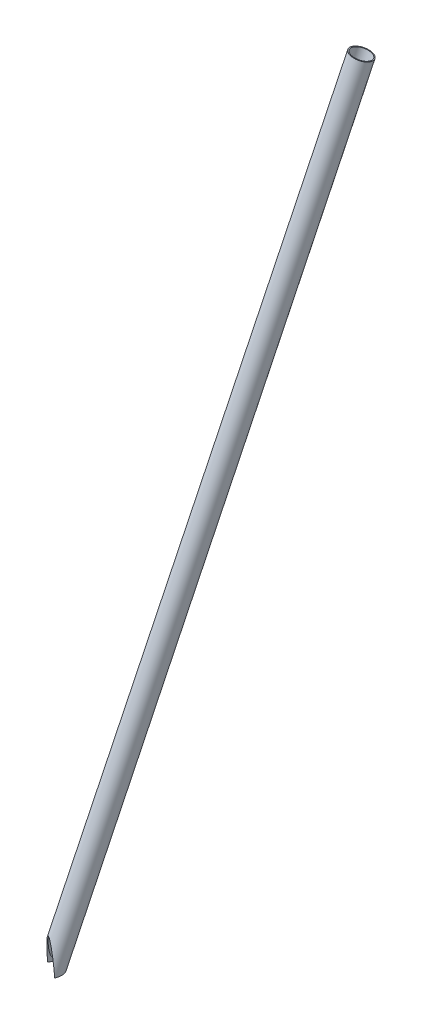
ISO-10303-21;
HEADER;
FILE_DESCRIPTION(('STEP AP214'),'2;1');
FILE_NAME('part.step','',(''),(''),'','','');
FILE_SCHEMA(('AUTOMOTIVE_DESIGN { 1 0 10303 214 1 1 1 1 }'));
ENDSEC;
DATA;
#1=APPLICATION_CONTEXT('core data for automotive mechanical design processes');
#2=APPLICATION_PROTOCOL_DEFINITION('international standard','automotive_design',2000,#1);
#3=PRODUCT_CONTEXT('',#1,'mechanical');
#4=PRODUCT('Part','Part','',(#3));
#5=PRODUCT_RELATED_PRODUCT_CATEGORY('part','',(#4));
#6=PRODUCT_DEFINITION_FORMATION('','',#4);
#7=PRODUCT_DEFINITION_CONTEXT('part definition',#1,'design');
#8=PRODUCT_DEFINITION('design','',#6,#7);
#9=PRODUCT_DEFINITION_SHAPE('','',#8);
#10=(LENGTH_UNIT() NAMED_UNIT(*) SI_UNIT(.MILLI.,.METRE.));
#11=(NAMED_UNIT(*) PLANE_ANGLE_UNIT() SI_UNIT($,.RADIAN.));
#12=(NAMED_UNIT(*) SI_UNIT($,.STERADIAN.) SOLID_ANGLE_UNIT());
#13=UNCERTAINTY_MEASURE_WITH_UNIT(LENGTH_MEASURE(1.E-05),#10,'distance_accuracy_value','');
#14=(GEOMETRIC_REPRESENTATION_CONTEXT(3) GLOBAL_UNCERTAINTY_ASSIGNED_CONTEXT((#13)) GLOBAL_UNIT_ASSIGNED_CONTEXT((#10,
#11,#12)) REPRESENTATION_CONTEXT('',''));
#15=CARTESIAN_POINT('',(0.,0.,0.));
#16=DIRECTION('',(0.,0.,1.));
#17=DIRECTION('',(1.,0.,0.));
#18=AXIS2_PLACEMENT_3D('',#15,#16,#17);
#19=CARTESIAN_POINT('',(-115.,920.,-1946.51325703663));
#20=DIRECTION('',(-0.140336447675245,-0.956366902675742,0.256257739239816));
#21=DIRECTION('',(0.,-0.258819045102517,-0.965925826289069));
#22=AXIS2_PLACEMENT_3D('',#19,#20,#21);
#23=CYLINDRICAL_SURFACE('',#22,11.3);
#24=CARTESIAN_POINT('',(-115.,920.,-1946.51325703663));
#25=DIRECTION('',(0.140336447675245,0.956366902675757,-0.25625773923976));
#26=DIRECTION('',(0.,0.258819045102461,0.965925826289084));
#27=AXIS2_PLACEMENT_3D('',#24,#25,#26);
#28=CIRCLE('',#27,11.3);
#29=CARTESIAN_POINT('',(-115.,922.924655209658,-1935.59829519956));
#30=VERTEX_POINT('',#29);
#31=EDGE_CURVE('E81',#30,#30,#28,.T.);
#32=ORIENTED_EDGE('',*,*,#31,.T.);
#33=EDGE_LOOP('',(#32));
#34=FACE_BOUND('',#33,.T.);
#35=CARTESIAN_POINT('',(-249.195264006611,2.55947156010267,-1712.38442917621));
#36=CARTESIAN_POINT('',(-248.881859184372,2.54464206513333,-1712.38045600705));
#37=CARTESIAN_POINT('',(-248.568511648203,2.53222092860068,-1712.36370490095));
#38=CARTESIAN_POINT('',(-247.944132457084,2.51127256095402,-1712.30443093258));
#39=CARTESIAN_POINT('',(-247.633100721694,2.5027451939631,-1712.26190896973));
#40=CARTESIAN_POINT('',(-247.015691468702,2.48889315260226,-1712.15112483738));
#41=CARTESIAN_POINT('',(-246.709312368436,2.4835673642509,-1712.08287163446));
#42=CARTESIAN_POINT('',(-246.103325479148,2.47560514391285,-1711.92087659758));
#43=CARTESIAN_POINT('',(-245.803717731063,2.47296872818105,-1711.82713460957));
#44=CARTESIAN_POINT('',(-245.213206379291,2.47002625318554,-1711.61456433105));
#45=CARTESIAN_POINT('',(-244.922311152293,2.46972236915793,-1711.49571273029));
#46=CARTESIAN_POINT('',(-244.351671204189,2.47122317343356,-1711.23372923194));
#47=CARTESIAN_POINT('',(-244.071926482791,2.47302786168179,-1711.09059733498));
#48=CARTESIAN_POINT('',(-243.525641735681,2.47863797494978,-1710.78104770302));
#49=CARTESIAN_POINT('',(-243.259102094184,2.48244345814745,-1710.61462929102));
#50=CARTESIAN_POINT('',(-242.741173259353,2.49206240210747,-1710.25974088523));
#51=CARTESIAN_POINT('',(-242.489783950031,2.49787584749517,-1710.07127106031));
#52=CARTESIAN_POINT('',(-242.006796606194,2.51155432214945,-1709.67606472829));
#53=CARTESIAN_POINT('',(-241.77500038864,2.51939438859935,-1709.46956943639));
#54=CARTESIAN_POINT('',(-241.329483435328,2.53739864134856,-1709.0380226035));
#55=CARTESIAN_POINT('',(-241.115762573893,2.54756281148666,-1708.81297119156));
#56=CARTESIAN_POINT('',(-240.707742761377,2.5705930417986,-1708.3460225779));
#57=CARTESIAN_POINT('',(-240.513444494451,2.5834591970997,-1708.10412478328));
#58=CARTESIAN_POINT('',(-240.145435025141,2.61243196145784,-1707.60533409992));
#59=CARTESIAN_POINT('',(-239.971723898501,2.62853858243669,-1707.34844115601));
#60=CARTESIAN_POINT('',(-239.643793049816,2.66495786614685,-1706.81828541507));
#61=CARTESIAN_POINT('',(-239.489846413413,2.68532095447395,-1706.54485717721));
#62=CARTESIAN_POINT('',(-239.204829160127,2.73115872360952,-1705.98672179315));
#63=CARTESIAN_POINT('',(-239.073759832802,2.7566336923929,-1705.70201401224));
#64=CARTESIAN_POINT('',(-238.835052541701,2.81409198955363,-1705.12343757812));
#65=CARTESIAN_POINT('',(-238.727424353066,2.84607802238146,-1704.82956516136));
#66=CARTESIAN_POINT('',(-238.536086144494,2.918409014321,-1704.23516271281));
#67=CARTESIAN_POINT('',(-238.452372568163,2.95875272900331,-1703.93463367812));
#68=CARTESIAN_POINT('',(-238.319796817039,3.04345572300458,-1703.37486353575));
#69=CARTESIAN_POINT('',(-238.267592382049,3.08630806346505,-1703.11618166084));
#70=CARTESIAN_POINT('',(-238.180602149123,3.18192239181066,-1702.59767026325));
#71=CARTESIAN_POINT('',(-238.145817363874,3.23468495557958,-1702.33784067473));
#72=CARTESIAN_POINT('',(-238.093550308581,3.3526278572999,-1701.81957706151));
#73=CARTESIAN_POINT('',(-238.076046389308,3.41779253560023,-1701.56114169506));
#74=CARTESIAN_POINT('',(-238.057877099847,3.56377809405097,-1701.04813251408));
#75=CARTESIAN_POINT('',(-238.057204672079,3.6445923978632,-1700.79355712578));
#76=CARTESIAN_POINT('',(-238.069605709046,3.79778180950274,-1700.36895371641));
#77=CARTESIAN_POINT('',(-238.078519596471,3.86512192451658,-1700.19697909495));
#78=CARTESIAN_POINT('',(-238.103565634967,4.01037812448417,-1699.85811615189));
#79=CARTESIAN_POINT('',(-238.119695443519,4.08829077154155,-1699.69122619841));
#80=CARTESIAN_POINT('',(-238.158490695122,4.25566626134785,-1699.36456881181));
#81=CARTESIAN_POINT('',(-238.181141539256,4.34510306010667,-1699.20478637922));
#82=CARTESIAN_POINT('',(-238.232129828599,4.53645564046015,-1698.89380308634));
#83=CARTESIAN_POINT('',(-238.260467064889,4.63837096353854,-1698.74260191104));
#84=CARTESIAN_POINT('',(-238.321981107035,4.85569083796864,-1698.44950119263));
#85=CARTESIAN_POINT('',(-238.355191564831,4.97118797721269,-1698.30767717544));
#86=CARTESIAN_POINT('',(-238.425071498678,5.21455084804261,-1698.03601244141));
#87=CARTESIAN_POINT('',(-238.461740847909,5.3424161261571,-1697.90617128556));
#88=CARTESIAN_POINT('',(-238.537362324148,5.6094209709177,-1697.65919167713));
#89=CARTESIAN_POINT('',(-238.576316199258,5.74856920318742,-1697.54206315278));
#90=CARTESIAN_POINT('',(-238.655446440827,6.03641134105986,-1697.32068045367));
#91=CARTESIAN_POINT('',(-238.695623025665,6.18510695717179,-1697.21642859574));
#92=CARTESIAN_POINT('',(-238.791193885807,6.54611863606529,-1696.98432286187));
#93=CARTESIAN_POINT('',(-238.846776913649,6.76180421114091,-1696.86179219724));
#94=CARTESIAN_POINT('',(-238.95756056615,7.20354954581093,-1696.63699214924));
#95=CARTESIAN_POINT('',(-239.012760961019,7.42961500656601,-1696.5347340686));
#96=CARTESIAN_POINT('',(-239.1225474249,7.88982922782402,-1696.34695003777));
#97=CARTESIAN_POINT('',(-239.177129846344,8.12400848367287,-1696.26149768884));
#98=CARTESIAN_POINT('',(-239.285400966876,8.59717198010045,-1696.10490785002));
#99=CARTESIAN_POINT('',(-239.339089882167,8.83615502647104,-1696.03376684963));
#100=CARTESIAN_POINT('',(-239.437165350973,9.27854966759336,-1695.91379826926));
#101=CARTESIAN_POINT('',(-239.481653769307,9.48147211714546,-1695.86322260076));
#102=CARTESIAN_POINT('',(-239.570317104072,9.889027125761,-1695.76914126702));
#103=CARTESIAN_POINT('',(-239.614491987289,10.0936598611367,-1695.72563634041));
#104=CARTESIAN_POINT('',(-239.746856473488,10.7095977044424,-1695.60414066997));
#105=CARTESIAN_POINT('',(-239.834841114335,11.122737735008,-1695.53522209986));
#106=CARTESIAN_POINT('',(-240.011803659234,11.9523303324023,-1695.41552950123));
#107=CARTESIAN_POINT('',(-240.100783386653,12.3687883428584,-1695.36479770473));
#108=CARTESIAN_POINT('',(-240.280704076143,13.2026498301547,-1695.27785061403));
#109=CARTESIAN_POINT('',(-240.371644492935,13.6200530159584,-1695.24163133731));
#110=CARTESIAN_POINT('',(-240.556968395891,14.4571132883687,-1695.18094854688));
#111=CARTESIAN_POINT('',(-240.651366730615,14.876771279431,-1695.15654427198));
#112=CARTESIAN_POINT('',(-240.84406342026,15.7156812337254,-1695.11799827542));
#113=CARTESIAN_POINT('',(-240.942362007508,16.1349331712416,-1695.10385716608));
#114=CARTESIAN_POINT('',(-241.143504026876,16.9719208786581,-1695.08467646948));
#115=CARTESIAN_POINT('',(-241.246340813908,17.389657955677,-1695.07962399935));
#116=CARTESIAN_POINT('',(-241.457434026492,18.2237690768373,-1695.07781970331));
#117=CARTESIAN_POINT('',(-241.565690342541,18.6401431483375,-1695.08106770976));
#118=CARTESIAN_POINT('',(-241.79090249755,19.4805643130989,-1695.09556868142));
#119=CARTESIAN_POINT('',(-241.908000267388,19.9045703300718,-1695.1070021745));
#120=CARTESIAN_POINT('',(-242.149475880832,20.7502243316759,-1695.13784079417));
#121=CARTESIAN_POINT('',(-242.273853828045,21.1718722826549,-1695.15724603424));
#122=CARTESIAN_POINT('',(-242.530913498762,22.0126288724876,-1695.204042279));
#123=CARTESIAN_POINT('',(-242.663602963613,22.4317347329365,-1695.23144081818));
#124=CARTESIAN_POINT('',(-242.938200771699,23.2662973631792,-1695.29441508514));
#125=CARTESIAN_POINT('',(-243.080108892356,23.681754220801,-1695.32999061554));
#126=CARTESIAN_POINT('',(-243.373819347588,24.5066788603145,-1695.40958889247));
#127=CARTESIAN_POINT('',(-243.52558471724,24.9161626821357,-1695.45358116149));
#128=CARTESIAN_POINT('',(-243.840893929855,25.7295455604503,-1695.550739577));
#129=CARTESIAN_POINT('',(-244.004438984795,26.1334440371741,-1695.60390666826));
#130=CARTESIAN_POINT('',(-244.344816175883,26.9335465198796,-1695.72025890658));
#131=CARTESIAN_POINT('',(-244.521630870393,27.329759793744,-1695.78343102027));
#132=CARTESIAN_POINT('',(-244.890861023473,28.1127754943369,-1695.92109935618));
#133=CARTESIAN_POINT('',(-245.083271765003,28.4995807208645,-1695.99559216037));
#134=CARTESIAN_POINT('',(-245.45126334461,29.1941561803302,-1696.1435023615));
#135=CARTESIAN_POINT('',(-245.623904921118,29.5039206404705,-1696.21483061368));
#136=CARTESIAN_POINT('',(-245.983812884368,30.1124976400187,-1696.36776540686));
#137=CARTESIAN_POINT('',(-246.171085382125,30.4113055257141,-1696.44937625149));
#138=CARTESIAN_POINT('',(-246.561779689352,30.9927885500053,-1696.62417479399));
#139=CARTESIAN_POINT('',(-246.765128435174,31.275527655801,-1696.71731109253));
#140=CARTESIAN_POINT('',(-247.191392297114,31.8204064223664,-1696.91749759633));
#141=CARTESIAN_POINT('',(-247.414285013662,32.0825690292969,-1697.02453193884));
#142=CARTESIAN_POINT('',(-247.850927468629,32.5440877712925,-1697.23939354803));
#143=CARTESIAN_POINT('',(-248.061775643748,32.7471328880354,-1697.34512027111));
#144=CARTESIAN_POINT('',(-248.502664288504,33.1235260817493,-1697.57085607232));
#145=CARTESIAN_POINT('',(-248.7327202162,33.2968498902416,-1697.6908766877));
#146=CARTESIAN_POINT('',(-249.093575045512,33.5265024841449,-1697.88312002495));
#147=CARTESIAN_POINT('',(-249.217478300869,33.5984197287022,-1697.94978349866));
#148=CARTESIAN_POINT('',(-249.469737073528,33.7296165880989,-1698.08692845124));
#149=CARTESIAN_POINT('',(-249.598089733975,33.7889041435991,-1698.15740749598));
#150=CARTESIAN_POINT('',(-249.858334567619,33.8929035142364,-1698.3018120677));
#151=CARTESIAN_POINT('',(-249.990218361797,33.9376470074055,-1698.37572969797));
#152=CARTESIAN_POINT('',(-250.256691373626,34.0110167894709,-1698.52665110249));
#153=CARTESIAN_POINT('',(-250.391279925181,34.0396469973846,-1698.60365412144));
#154=CARTESIAN_POINT('',(-250.645875750294,34.0771989094518,-1698.75084211555));
#155=CARTESIAN_POINT('',(-250.765749295421,34.0880325520695,-1698.82077245934));
#156=CARTESIAN_POINT('',(-251.005266674893,34.0957251634953,-1698.96177808083));
#157=CARTESIAN_POINT('',(-251.124910531781,34.0925855820218,-1699.03285323898));
#158=CARTESIAN_POINT('',(-251.362819255222,34.0724034694864,-1699.17546221064));
#159=CARTESIAN_POINT('',(-251.481083365395,34.0553536454809,-1699.24699624522));
#160=CARTESIAN_POINT('',(-251.715068593797,34.0079161971759,-1699.38978495895));
#161=CARTESIAN_POINT('',(-251.830789465252,33.9775272845098,-1699.46103961046));
#162=CARTESIAN_POINT('',(-252.063540407982,33.902845194335,-1699.6056051927));
#163=CARTESIAN_POINT('',(-252.180424470871,33.8580259033003,-1699.67887825683));
#164=CARTESIAN_POINT('',(-252.409803861255,33.7563022340919,-1699.82394933458));
#165=CARTESIAN_POINT('',(-252.522296463578,33.6993904886097,-1699.89574641958));
#166=CARTESIAN_POINT('',(-252.852670875958,33.5126076938993,-1700.1084374461));
#167=CARTESIAN_POINT('',(-253.063376908139,33.3667138254679,-1700.24658607035));
#168=CARTESIAN_POINT('',(-253.42179720005,33.0779607042374,-1700.48543957508));
#169=CARTESIAN_POINT('',(-253.573370517443,32.9410711946348,-1700.58785337345));
#170=CARTESIAN_POINT('',(-253.865015122548,32.6518689865285,-1700.7874047986));
#171=CARTESIAN_POINT('',(-254.005079185143,32.4995467318299,-1700.88453909835));
#172=CARTESIAN_POINT('',(-254.274746750092,32.1826107028392,-1701.07388606853));
#173=CARTESIAN_POINT('',(-254.404331475878,32.0179758401679,-1701.16608980863));
#174=CARTESIAN_POINT('',(-254.653871899789,31.6790816513327,-1701.34584641314));
#175=CARTESIAN_POINT('',(-254.773823680348,31.5048184576247,-1701.4333973805));
#176=CARTESIAN_POINT('',(-255.007459339532,31.1448558490604,-1701.60604000617));
#177=CARTESIAN_POINT('',(-255.120956603994,30.9589923701327,-1701.69104027415));
#178=CARTESIAN_POINT('',(-255.339773779045,30.5808306111275,-1701.85700932302));
#179=CARTESIAN_POINT('',(-255.445094669677,30.3885331062161,-1701.93797858665));
#180=CARTESIAN_POINT('',(-255.648479183146,29.9984621582338,-1702.09636629481));
#181=CARTESIAN_POINT('',(-255.746535741427,29.8006836351307,-1702.17378125567));
#182=CARTESIAN_POINT('',(-255.935977439395,29.4007126116885,-1702.32533281327));
#183=CARTESIAN_POINT('',(-256.027361756268,29.1985195709362,-1702.39946900524));
#184=CARTESIAN_POINT('',(-256.292881699833,28.5853521503211,-1702.6178155007));
#185=CARTESIAN_POINT('',(-256.457866190769,28.1688034048789,-1702.7575585548));
#186=CARTESIAN_POINT('',(-256.767153312296,27.3253403080926,-1703.027132577));
#187=CARTESIAN_POINT('',(-256.911464974403,26.8984305791541,-1703.15696786193));
#188=CARTESIAN_POINT('',(-257.208896939718,25.952057125697,-1703.43316552409));
#189=CARTESIAN_POINT('',(-257.358183030964,25.4308793610177,-1703.57776734618));
#190=CARTESIAN_POINT('',(-257.634770137595,24.3801737694111,-1703.85758644594));
#191=CARTESIAN_POINT('',(-257.762065641763,23.8506438854817,-1703.99280136604));
#192=CARTESIAN_POINT('',(-257.997158629977,22.7847670421381,-1704.25587079746));
#193=CARTESIAN_POINT('',(-258.104931729285,22.2484124405715,-1704.38371596952));
#194=CARTESIAN_POINT('',(-258.302388119966,21.1711133895304,-1704.63355929508));
#195=CARTESIAN_POINT('',(-258.392073150919,20.6301693866507,-1704.75555801));
#196=CARTESIAN_POINT('',(-258.554282006563,19.5451039814132,-1704.99532195215));
#197=CARTESIAN_POINT('',(-258.62681496196,19.0009844283228,-1705.11308940341));
#198=CARTESIAN_POINT('',(-258.755129078794,17.9102286395446,-1705.34624100155));
#199=CARTESIAN_POINT('',(-258.810909083573,17.3635922327325,-1705.46162498337));
#200=CARTESIAN_POINT('',(-258.905321026873,16.2693043433398,-1705.69197198573));
#201=CARTESIAN_POINT('',(-258.94396943444,15.7216543460833,-1705.80693530475));
#202=CARTESIAN_POINT('',(-259.002988836894,14.6259038547815,-1706.03917267328));
#203=CARTESIAN_POINT('',(-259.023362499156,14.0778034381725,-1706.15644638302));
#204=CARTESIAN_POINT('',(-259.040038760229,13.1593458255911,-1706.35816816254));
#205=CARTESIAN_POINT('',(-259.04198913582,12.7887342880521,-1706.44099020815));
#206=CARTESIAN_POINT('',(-259.034964377978,12.0485313224514,-1706.61098448895));
#207=CARTESIAN_POINT('',(-259.025987755403,11.6789400403112,-1706.69815731551));
#208=CARTESIAN_POINT('',(-258.995107228009,10.9418810562365,-1706.8788871054));
#209=CARTESIAN_POINT('',(-258.973204970774,10.5744130896777,-1706.97244325373));
#210=CARTESIAN_POINT('',(-258.913480196074,9.84322027665241,-1707.16868749595));
#211=CARTESIAN_POINT('',(-258.875662306865,9.47949437347194,-1707.27137292821));
#212=CARTESIAN_POINT('',(-258.795870843006,8.88106471172163,-1707.45248242327));
#213=CARTESIAN_POINT('',(-258.759674053498,8.64450888058041,-1707.5272969565));
#214=CARTESIAN_POINT('',(-258.6765070012,8.17550851657022,-1707.68381529189));
#215=CARTESIAN_POINT('',(-258.629535225989,7.94306456579981,-1707.76552006018));
#216=CARTESIAN_POINT('',(-258.522671287796,7.48468555945624,-1707.93700045023));
#217=CARTESIAN_POINT('',(-258.462805206562,7.25873839327871,-1708.02675956947));
#218=CARTESIAN_POINT('',(-258.327421006124,6.81563768967408,-1708.21573713539));
#219=CARTESIAN_POINT('',(-258.2519106676,6.59847984480716,-1708.31495086662));
#220=CARTESIAN_POINT('',(-258.106896704297,6.23751552153781,-1708.49341369616));
#221=CARTESIAN_POINT('',(-258.041956553283,6.09063764601952,-1708.57015337756));
#222=CARTESIAN_POINT('',(-257.901836338563,5.80471768929254,-1708.72867294837));
#223=CARTESIAN_POINT('',(-257.826659902952,5.66567285635561,-1708.81045104639));
#224=CARTESIAN_POINT('',(-257.665553457667,5.39717733451695,-1708.97843686628));
#225=CARTESIAN_POINT('',(-257.579642237274,5.26771049649425,-1709.064636697));
#226=CARTESIAN_POINT('',(-257.39674381391,5.0194803193535,-1709.24064968701));
#227=CARTESIAN_POINT('',(-257.299756765681,4.90071683073838,-1709.3304627958));
#228=CARTESIAN_POINT('',(-257.094759458017,4.67459475462308,-1709.51254418794));
#229=CARTESIAN_POINT('',(-256.986727138556,4.56725990084901,-1709.60481710141));
#230=CARTESIAN_POINT('',(-256.760498189954,4.3645974488311,-1709.7900589444));
#231=CARTESIAN_POINT('',(-256.642301263083,4.26927020250025,-1709.88302789425));
#232=CARTESIAN_POINT('',(-256.396464061306,4.0901499302471,-1710.06824544102));
#233=CARTESIAN_POINT('',(-256.268804770295,4.00638115510788,-1710.16049215156));
#234=CARTESIAN_POINT('',(-256.005312729317,3.8498184094577,-1710.34262678205));
#235=CARTESIAN_POINT('',(-255.869477417635,3.77702790397332,-1710.43251394991));
#236=CARTESIAN_POINT('',(-255.536793604313,3.61515840253742,-1710.64272892811));
#237=CARTESIAN_POINT('',(-255.336658009521,3.53066035015672,-1710.76139173006));
#238=CARTESIAN_POINT('',(-254.925184189869,3.37768120829026,-1710.98921891143));
#239=CARTESIAN_POINT('',(-254.713841645666,3.30920635025519,-1711.09837958512));
#240=CARTESIAN_POINT('',(-254.281593605473,3.18526021679998,-1711.30559185877));
#241=CARTESIAN_POINT('',(-254.06067038424,3.12981437827862,-1711.40362153779));
#242=CARTESIAN_POINT('',(-253.61132774954,3.02961213869273,-1711.58704245042));
#243=CARTESIAN_POINT('',(-253.38290820897,2.98485591898153,-1711.6724334696));
#244=CARTESIAN_POINT('',(-252.836436272288,2.88938518404715,-1711.85799950978));
#245=CARTESIAN_POINT('',(-252.515764470116,2.84234195885902,-1711.952401878));
#246=CARTESIAN_POINT('',(-251.86615643341,2.76028510741211,-1712.11435323242));
#247=CARTESIAN_POINT('',(-251.537217597322,2.72527532013517,-1712.18189365003));
#248=CARTESIAN_POINT('',(-250.874053122568,2.66445577846161,-1712.28886378197));
#249=CARTESIAN_POINT('',(-250.53982890193,2.63864359872749,-1712.32830090966));
#250=CARTESIAN_POINT('',(-249.868802140064,2.5941187726256,-1712.37821583485));
#251=CARTESIAN_POINT('',(-249.532000006948,2.57540502528459,-1712.38869812487));
#252=CARTESIAN_POINT('',(-249.195264006611,2.55947156010267,-1712.38442917621));
#253=B_SPLINE_CURVE_WITH_KNOTS('',3,(#35,#36,#37,#38,#39,#40,#41,#42,#43,#44,#45,#46,#47,#48,
#49,#50,#51,#52,#53,#54,#55,#56,#57,#58,#59,#60,#61,#62,#63,#64,#65,#66,#67,#68,#69,#70,#71,#72,
#73,#74,#75,#76,#77,#78,#79,#80,#81,#82,#83,#84,#85,#86,#87,#88,#89,#90,#91,#92,#93,#94,#95,#96,
#97,#98,#99,#100,#101,#102,#103,#104,#105,#106,#107,#108,#109,#110,#111,#112,#113,#114,#115,
#116,#117,#118,#119,#120,#121,#122,#123,#124,#125,#126,#127,#128,#129,#130,#131,#132,#133,#134,
#135,#136,#137,#138,#139,#140,#141,#142,#143,#144,#145,#146,#147,#148,#149,#150,#151,#152,#153,
#154,#155,#156,#157,#158,#159,#160,#161,#162,#163,#164,#165,#166,#167,#168,#169,#170,#171,#172,
#173,#174,#175,#176,#177,#178,#179,#180,#181,#182,#183,#184,#185,#186,#187,#188,#189,#190,#191,
#192,#193,#194,#195,#196,#197,#198,#199,#200,#201,#202,#203,#204,#205,#206,#207,#208,#209,#210,
#211,#212,#213,#214,#215,#216,#217,#218,#219,#220,#221,#222,#223,#224,#225,#226,#227,#228,#229,
#230,#231,#232,#233,#234,#235,#236,#237,#238,#239,#240,#241,#242,#243,#244,#245,#246,#247,#248,
#249,#250,#251,#252),.UNSPECIFIED.,.T.,.F.,(4,2,2,2,2,2,2,2,2,2,2,2,2,2,2,2,2,2,2,2,2,2,2,2,2,2,
2,2,2,2,2,2,2,2,2,2,2,2,2,2,2,2,2,2,2,2,2,2,2,2,2,2,2,2,2,2,2,2,2,2,2,2,2,2,2,2,2,2,2,2,2,2,2,2,
2,2,2,2,2,2,2,2,2,2,2,2,2,2,2,2,2,2,2,2,2,2,2,2,2,2,2,2,2,2,2,2,2,2,4),(0.,0.941053509063759,
1.88207417663133,2.82276722855921,3.76346596611161,4.70504185938751,5.64661772809673,
6.58822097690043,7.52981701616181,8.46032602938835,9.3908285722957,10.3213638803761,
11.2519026119989,12.1941628398861,13.136476164385,14.0791816918998,15.0217469546371,
15.8231105146082,16.624520656287,17.4249255236293,18.2249947691887,18.7792648975057,
19.3333552224125,19.8862146018202,20.4390536728178,20.9959076355654,21.5527411892854,
22.1100065327912,22.6673719960516,23.4286950200027,24.1904413237992,24.9554528564635,
25.720276505661,26.3615679228758,27.0029262864917,28.286290427938,29.5726156923384,
30.8585877227736,32.1509423333341,33.4433740422522,34.7339723203989,36.0245445323048,
37.3444930467617,38.6644603504443,39.9856758986257,41.3068595588735,42.6233467075064,
43.9399694994914,45.2548910485788,46.569416371689,47.6541102695587,48.7392596675878,
49.8197332126916,50.8989842086144,51.830988701913,52.7637506224436,53.2372868119803,
53.7105243907301,54.1827242070047,54.6548091267889,55.0717340264972,55.4886156713609,
55.9057160219405,56.3228566673643,56.7573608496067,57.1921305157853,58.0619328348941,
58.746510560987,59.4315148094755,60.1177204199994,60.8042037009145,61.5052297547454,
62.2061716515187,62.9077865009465,63.6094877271158,65.0165082204032,66.4229121295551,
68.1054662258257,69.7884413891306,71.4735044152957,73.1584053069113,74.8424072321239,
76.5265253975475,78.2090210468168,79.8912710795101,81.0304029893111,82.1696901583954,
83.3088321380671,84.4476430845698,85.1995594271309,85.9515813764093,86.7020962363492,
87.4522387194814,87.9857352726803,88.5190432259372,89.0514304641817,89.5838102652518,
90.1172749336667,90.6507552329636,91.1853383373336,91.720089818471,92.4615606716719,
93.2033194068219,93.9465144838659,94.689722168594,95.7009332135102,96.7124665624531,
97.7237329801918,98.7348424854044),.UNSPECIFIED.);
#254=CARTESIAN_POINT('',(-249.195264006611,2.55947156010267,-1712.38442917621));
#255=VERTEX_POINT('',#254);
#256=EDGE_CURVE('E46',#255,#255,#253,.T.);
#257=ORIENTED_EDGE('',*,*,#256,.T.);
#258=EDGE_LOOP('',(#257));
#259=FACE_BOUND('',#258,.T.);
#260=ADVANCED_FACE('F41',(#34,#259),#23,.F.);
#261=CARTESIAN_POINT('',(-115.,920.,-1946.51325703663));
#262=DIRECTION('',(-0.140336447675245,-0.956366902675742,0.256257739239816));
#263=DIRECTION('',(0.,-0.258819045102517,-0.965925826289069));
#264=AXIS2_PLACEMENT_3D('',#261,#262,#263);
#265=CYLINDRICAL_SURFACE('',#264,12.5);
#266=CARTESIAN_POINT('',(-115.,920.,-1946.51325703663));
#267=DIRECTION('',(0.140336447675245,0.956366902675757,-0.25625773923976));
#268=DIRECTION('',(0.,0.258819045102461,0.965925826289084));
#269=AXIS2_PLACEMENT_3D('',#266,#267,#268);
#270=CIRCLE('',#269,12.5);
#271=CARTESIAN_POINT('',(-115.,923.235238063781,-1934.43918420802));
#272=VERTEX_POINT('',#271);
#273=EDGE_CURVE('E63',#272,#272,#270,.T.);
#274=ORIENTED_EDGE('',*,*,#273,.F.);
#275=EDGE_LOOP('',(#274));
#276=FACE_BOUND('',#275,.T.);
#277=CARTESIAN_POINT('',(-250.,1.11022302462516E-13,-1700.));
#278=DIRECTION('',(-0.508456010272344,-0.0599232902931691,0.859000398660193));
#279=DIRECTION('',(0.0394871934442315,-0.998148808069163,-0.0462570913915508));
#280=AXIS2_PLACEMENT_3D('',#277,#278,#279);
#281=ELLIPSE('',#280,35.8382798156598,12.5);
#282=CARTESIAN_POINT('',(-239.247723735385,0.129997734685305,-1693.62648796044));
#283=VERTEX_POINT('',#282);
#284=CARTESIAN_POINT('',(-260.752276264615,-0.129997734685139,-1706.37351203956));
#285=VERTEX_POINT('',#284);
#286=EDGE_CURVE('E56',#283,#285,#281,.T.);
#287=ORIENTED_EDGE('',*,*,#286,.F.);
#288=CARTESIAN_POINT('',(-250.,1.11022302462516E-13,-1700.));
#289=DIRECTION('',(0.0394871934442315,-0.998148808069163,-0.0462570913915508));
#290=DIRECTION('',(-0.508456010272344,-0.0599232902931691,0.859000398660193));
#291=AXIS2_PLACEMENT_3D('',#288,#289,#290);
#292=ELLIPSE('',#291,13.3375835216697,12.5);
#293=EDGE_CURVE('E11',#285,#283,#292,.T.);
#294=ORIENTED_EDGE('',*,*,#293,.F.);
#295=EDGE_LOOP('',(#287,#294));
#296=FACE_BOUND('',#295,.T.);
#297=ADVANCED_FACE('F65',(#276,#296),#265,.T.);
#298=CARTESIAN_POINT('',(-115.,920.,-1946.51325703663));
#299=DIRECTION('',(0.140336447675245,0.956366902675757,-0.25625773923976));
#300=DIRECTION('',(0.,0.258819045102461,0.965925826289084));
#301=AXIS2_PLACEMENT_3D('',#298,#299,#300);
#302=PLANE('',#301);
#303=ORIENTED_EDGE('',*,*,#31,.F.);
#304=EDGE_LOOP('',(#303));
#305=FACE_BOUND('',#304,.T.);
#306=ORIENTED_EDGE('',*,*,#273,.T.);
#307=EDGE_LOOP('',(#306));
#308=FACE_BOUND('',#307,.T.);
#309=ADVANCED_FACE('F67',(#305,#308),#302,.T.);
#310=CARTESIAN_POINT('',(-250.,0.,-1700.));
#311=DIRECTION('',(-0.214351342090107,0.914565726251124,0.342962147344171));
#312=DIRECTION('',(0.,-0.351123441588391,0.936329177569045));
#313=AXIS2_PLACEMENT_3D('',#310,#311,#312);
#314=CYLINDRICAL_SURFACE('',#313,12.5);
#315=ORIENTED_EDGE('',*,*,#256,.F.);
#316=EDGE_LOOP('',(#315));
#317=FACE_BOUND('',#316,.T.);
#318=ORIENTED_EDGE('',*,*,#286,.T.);
#319=ORIENTED_EDGE('',*,*,#293,.T.);
#320=EDGE_LOOP('',(#318,#319));
#321=FACE_BOUND('',#320,.T.);
#322=ADVANCED_FACE('F43',(#317,#321),#314,.F.);
#323=CLOSED_SHELL('',(#260,#297,#309,#322));
#324=MANIFOLD_SOLID_BREP('B2',#323);
#325=ADVANCED_BREP_SHAPE_REPRESENTATION('',(#18,#324),#14);
#326=SHAPE_DEFINITION_REPRESENTATION(#9,#325);
ENDSEC;
END-ISO-10303-21;
